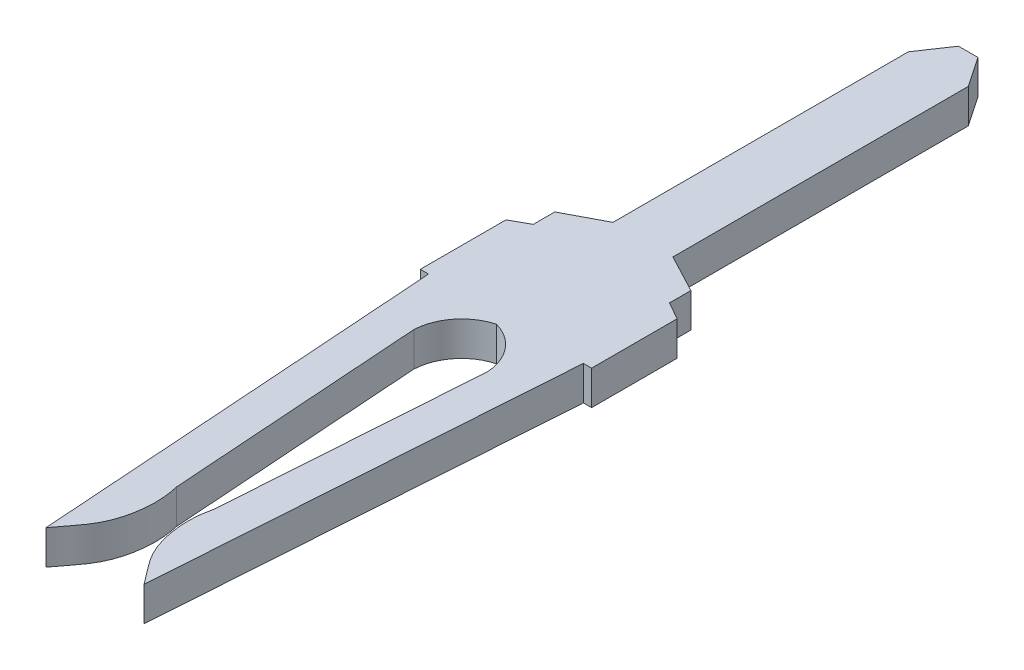
ISO-10303-21;
HEADER;
FILE_DESCRIPTION(('STEP AP214'),'2;1');
FILE_NAME('part.step','',(''),(''),'','','');
FILE_SCHEMA(('AUTOMOTIVE_DESIGN { 1 0 10303 214 1 1 1 1 }'));
ENDSEC;
DATA;
#1=APPLICATION_CONTEXT('core data for automotive mechanical design processes');
#2=APPLICATION_PROTOCOL_DEFINITION('international standard','automotive_design',2000,#1);
#3=PRODUCT_CONTEXT('',#1,'mechanical');
#4=PRODUCT('Part','Part','',(#3));
#5=PRODUCT_RELATED_PRODUCT_CATEGORY('part','',(#4));
#6=PRODUCT_DEFINITION_FORMATION('','',#4);
#7=PRODUCT_DEFINITION_CONTEXT('part definition',#1,'design');
#8=PRODUCT_DEFINITION('design','',#6,#7);
#9=PRODUCT_DEFINITION_SHAPE('','',#8);
#10=(LENGTH_UNIT() NAMED_UNIT(*) SI_UNIT(.MILLI.,.METRE.));
#11=(NAMED_UNIT(*) PLANE_ANGLE_UNIT() SI_UNIT($,.RADIAN.));
#12=(NAMED_UNIT(*) SI_UNIT($,.STERADIAN.) SOLID_ANGLE_UNIT());
#13=UNCERTAINTY_MEASURE_WITH_UNIT(LENGTH_MEASURE(1.E-05),#10,'distance_accuracy_value','');
#14=(GEOMETRIC_REPRESENTATION_CONTEXT(3) GLOBAL_UNCERTAINTY_ASSIGNED_CONTEXT((#13)) GLOBAL_UNIT_ASSIGNED_CONTEXT((#10,
#11,#12)) REPRESENTATION_CONTEXT('',''));
#15=CARTESIAN_POINT('',(0.,0.,0.));
#16=DIRECTION('',(0.,0.,1.));
#17=DIRECTION('',(1.,0.,0.));
#18=AXIS2_PLACEMENT_3D('',#15,#16,#17);
#19=CARTESIAN_POINT('',(-0.246151696229,0.,5.652903953342));
#20=DIRECTION('',(0.,1.,0.));
#21=DIRECTION('',(0.,0.,1.));
#22=AXIS2_PLACEMENT_3D('',#19,#20,#21);
#23=PLANE('',#22);
#24=DIRECTION('',(1.,0.,0.));
#25=VECTOR('',#24,1.);
#26=CARTESIAN_POINT('',(-0.246151696229,0.,-4.02319745895));
#27=LINE('',#26,#25);
#28=CARTESIAN_POINT('',(0.113873753397,0.,-4.02319745895));
#29=VERTEX_POINT('',#28);
#30=CARTESIAN_POINT('',(-0.113873753397,0.,-4.02319745895));
#31=VERTEX_POINT('',#30);
#32=EDGE_CURVE('E280',#29,#31,#27,.F.);
#33=ORIENTED_EDGE('',*,*,#32,.F.);
#34=DIRECTION('',(-0.55927147254417,0.,-0.828984571628613));
#35=VECTOR('',#34,1.);
#36=CARTESIAN_POINT('',(0.35,0.,-3.67319745895));
#37=LINE('',#36,#35);
#38=CARTESIAN_POINT('',(0.35,0.,-3.67319745895));
#39=VERTEX_POINT('',#38);
#40=EDGE_CURVE('E329',#39,#29,#37,.T.);
#41=ORIENTED_EDGE('',*,*,#40,.F.);
#42=DIRECTION('',(0.,0.,1.));
#43=VECTOR('',#42,1.);
#44=CARTESIAN_POINT('',(0.35,0.,-0.22319745895));
#45=LINE('',#44,#43);
#46=CARTESIAN_POINT('',(0.350000000000108,0.,-0.223197458950205));
#47=VERTEX_POINT('',#46);
#48=EDGE_CURVE('E339',#39,#47,#45,.T.);
#49=ORIENTED_EDGE('',*,*,#48,.T.);
#50=DIRECTION('',(0.884537528884218,0.,0.466469034337115));
#51=VECTOR('',#50,1.);
#52=CARTESIAN_POINT('',(0.795049227589,0.,0.01150336113542));
#53=LINE('',#52,#51);
#54=CARTESIAN_POINT('',(0.795049227589,0.,0.0115033611354195));
#55=VERTEX_POINT('',#54);
#56=EDGE_CURVE('E403',#47,#55,#53,.T.);
#57=ORIENTED_EDGE('',*,*,#56,.T.);
#58=DIRECTION('',(0.,0.,1.));
#59=VECTOR('',#58,1.);
#60=CARTESIAN_POINT('',(0.795049227589,0.,0.262440024241));
#61=LINE('',#60,#59);
#62=CARTESIAN_POINT('',(0.795049227588895,0.,0.262440024241189));
#63=VERTEX_POINT('',#62);
#64=EDGE_CURVE('E408',#55,#63,#61,.T.);
#65=ORIENTED_EDGE('',*,*,#64,.T.);
#66=DIRECTION('',(0.873249577630097,0.,0.487273203828054));
#67=VECTOR('',#66,1.);
#68=CARTESIAN_POINT('',(1.,0.,0.37680254105));
#69=LINE('',#68,#67);
#70=CARTESIAN_POINT('',(1.,0.,0.37680254105));
#71=VERTEX_POINT('',#70);
#72=EDGE_CURVE('E413',#63,#71,#69,.T.);
#73=ORIENTED_EDGE('',*,*,#72,.T.);
#74=DIRECTION('',(0.,0.,1.));
#75=VECTOR('',#74,1.);
#76=CARTESIAN_POINT('',(1.,0.,1.37680254105));
#77=LINE('',#76,#75);
#78=CARTESIAN_POINT('',(1.,0.,1.37680254105));
#79=VERTEX_POINT('',#78);
#80=EDGE_CURVE('E418',#71,#79,#77,.T.);
#81=ORIENTED_EDGE('',*,*,#80,.T.);
#82=DIRECTION('',(-1.,0.,0.));
#83=VECTOR('',#82,1.);
#84=CARTESIAN_POINT('',(0.90406091182,0.,1.37680254105));
#85=LINE('',#84,#83);
#86=CARTESIAN_POINT('',(0.904060911820046,0.,1.37680254105));
#87=VERTEX_POINT('',#86);
#88=EDGE_CURVE('E290',#79,#87,#85,.T.);
#89=ORIENTED_EDGE('',*,*,#88,.T.);
#90=DIRECTION('',(-0.0688630511178736,0.,0.997626122448053));
#91=VECTOR('',#90,1.);
#92=CARTESIAN_POINT('',(0.572731731551,0.,6.17680254105));
#93=LINE('',#92,#91);
#94=CARTESIAN_POINT('',(0.572731731551,0.,6.17680254105));
#95=VERTEX_POINT('',#94);
#96=EDGE_CURVE('E283',#87,#95,#93,.T.);
#97=ORIENTED_EDGE('',*,*,#96,.T.);
#98=CARTESIAN_POINT('',(0.222849497996,0.,5.000667554773));
#99=CARTESIAN_POINT('',(0.187985398045,0.,5.161915521912));
#100=CARTESIAN_POINT('',(0.181441154277,0.,5.437578205445));
#101=CARTESIAN_POINT('',(0.271539644198,0.,5.819941023181));
#102=CARTESIAN_POINT('',(0.496322858964,0.,6.066977657199));
#103=CARTESIAN_POINT('',(0.572731731551,0.,6.17680254105));
#104=(BOUNDED_CURVE() B_SPLINE_CURVE(3,(#98,#99,#100,#101,#102,#103),.UNSPECIFIED.,.F.,
.F.) B_SPLINE_CURVE_WITH_KNOTS((4,1,1,4),(0.,0.233999874933,0.693587506264,1.),
.UNSPECIFIED.) CURVE() GEOMETRIC_REPRESENTATION_ITEM() RATIONAL_B_SPLINE_CURVE((1.,1.,1.,1.,1.,1.)) REPRESENTATION_ITEM(''));
#105=CARTESIAN_POINT('',(0.222849497996347,0.,5.00066755477302));
#106=VERTEX_POINT('',#105);
#107=EDGE_CURVE('E368',#95,#106,#104,.F.);
#108=ORIENTED_EDGE('',*,*,#107,.T.);
#109=DIRECTION('',(0.0688630511178736,0.,-0.997626122448053));
#110=VECTOR('',#109,1.);
#111=CARTESIAN_POINT('',(0.428204233383,0.,2.02567232781));
#112=LINE('',#111,#110);
#113=CARTESIAN_POINT('',(0.428204233382957,0.,2.02567232781062));
#114=VERTEX_POINT('',#113);
#115=EDGE_CURVE('E296',#106,#114,#112,.T.);
#116=ORIENTED_EDGE('',*,*,#115,.T.);
#117=CARTESIAN_POINT('',(-0.155934817315,0.,2.05123249917));
#118=DIRECTION('',(0.,1.,0.));
#119=DIRECTION('',(0.,0.,1.));
#120=AXIS2_PLACEMENT_3D('',#117,#118,#119);
#121=CIRCLE('',#120,0.584698001459);
#122=CARTESIAN_POINT('',(0.,0.,1.48771134991376));
#123=VERTEX_POINT('',#122);
#124=EDGE_CURVE('E376',#114,#123,#121,.T.);
#125=ORIENTED_EDGE('',*,*,#124,.T.);
#126=CARTESIAN_POINT('',(0.155934817315,0.,2.05123249917));
#127=DIRECTION('',(0.,1.,0.));
#128=DIRECTION('',(0.,0.,1.));
#129=AXIS2_PLACEMENT_3D('',#126,#127,#128);
#130=CIRCLE('',#129,0.584698001459);
#131=CARTESIAN_POINT('',(-0.428204233382751,0.,2.02567232780754));
#132=VERTEX_POINT('',#131);
#133=EDGE_CURVE('E382',#123,#132,#130,.T.);
#134=ORIENTED_EDGE('',*,*,#133,.T.);
#135=DIRECTION('',(0.0688630511178736,0.,0.997626122448053));
#136=VECTOR('',#135,1.);
#137=CARTESIAN_POINT('',(-0.222849497996,0.,5.000667554773));
#138=LINE('',#137,#136);
#139=CARTESIAN_POINT('',(-0.222849497996,0.,5.000667554773));
#140=VERTEX_POINT('',#139);
#141=EDGE_CURVE('E187',#132,#140,#138,.T.);
#142=ORIENTED_EDGE('',*,*,#141,.T.);
#143=CARTESIAN_POINT('',(-0.572731731551,0.,6.17680254105));
#144=CARTESIAN_POINT('',(-0.496322858964,0.,6.066977657199));
#145=CARTESIAN_POINT('',(-0.271539644198,0.,5.819941023181));
#146=CARTESIAN_POINT('',(-0.181441154277,0.,5.437578205445));
#147=CARTESIAN_POINT('',(-0.187985398045,0.,5.161915521912));
#148=CARTESIAN_POINT('',(-0.222849497996,0.,5.000667554773));
#149=(BOUNDED_CURVE() B_SPLINE_CURVE(3,(#143,#144,#145,#146,#147,#148),.UNSPECIFIED.,.F.,
.F.) B_SPLINE_CURVE_WITH_KNOTS((4,1,1,4),(0.,0.306412493736,0.766000125067,1.),
.UNSPECIFIED.) CURVE() GEOMETRIC_REPRESENTATION_ITEM() RATIONAL_B_SPLINE_CURVE((1.,1.,1.,1.,1.,1.)) REPRESENTATION_ITEM(''));
#150=CARTESIAN_POINT('',(-0.572731731550931,0.,6.17680254105));
#151=VERTEX_POINT('',#150);
#152=EDGE_CURVE('E20',#140,#151,#149,.F.);
#153=ORIENTED_EDGE('',*,*,#152,.T.);
#154=DIRECTION('',(-0.0688630511178736,0.,-0.997626122448053));
#155=VECTOR('',#154,1.);
#156=CARTESIAN_POINT('',(-0.90406091182,0.,1.37680254105));
#157=LINE('',#156,#155);
#158=CARTESIAN_POINT('',(-0.90406091182,0.,1.37680254105));
#159=VERTEX_POINT('',#158);
#160=EDGE_CURVE('E176',#151,#159,#157,.T.);
#161=ORIENTED_EDGE('',*,*,#160,.T.);
#162=DIRECTION('',(-1.,0.,0.));
#163=VECTOR('',#162,1.);
#164=CARTESIAN_POINT('',(-1.,0.,1.37680254105));
#165=LINE('',#164,#163);
#166=CARTESIAN_POINT('',(-1.,0.,1.37680254105));
#167=VERTEX_POINT('',#166);
#168=EDGE_CURVE('E202',#159,#167,#165,.T.);
#169=ORIENTED_EDGE('',*,*,#168,.T.);
#170=DIRECTION('',(0.,0.,-1.));
#171=VECTOR('',#170,1.);
#172=CARTESIAN_POINT('',(-1.,0.,0.37680254105));
#173=LINE('',#172,#171);
#174=CARTESIAN_POINT('',(-1.00000000000007,0.,0.376802541049874));
#175=VERTEX_POINT('',#174);
#176=EDGE_CURVE('E214',#167,#175,#173,.T.);
#177=ORIENTED_EDGE('',*,*,#176,.T.);
#178=DIRECTION('',(0.873249577630097,0.,-0.487273203828054));
#179=VECTOR('',#178,1.);
#180=CARTESIAN_POINT('',(-0.795049227589,0.,0.262440024241));
#181=LINE('',#180,#179);
#182=CARTESIAN_POINT('',(-0.795049227589,0.,0.262440024241));
#183=VERTEX_POINT('',#182);
#184=EDGE_CURVE('E224',#175,#183,#181,.T.);
#185=ORIENTED_EDGE('',*,*,#184,.T.);
#186=DIRECTION('',(0.,0.,-1.));
#187=VECTOR('',#186,1.);
#188=CARTESIAN_POINT('',(-0.795049227589,0.,0.01150336113542));
#189=LINE('',#188,#187);
#190=CARTESIAN_POINT('',(-0.795049227588928,0.,0.0115033611355565));
#191=VERTEX_POINT('',#190);
#192=EDGE_CURVE('E234',#183,#191,#189,.T.);
#193=ORIENTED_EDGE('',*,*,#192,.T.);
#194=DIRECTION('',(0.884537528884218,0.,-0.466469034337115));
#195=VECTOR('',#194,1.);
#196=CARTESIAN_POINT('',(-0.35,0.,-0.22319745895));
#197=LINE('',#196,#195);
#198=CARTESIAN_POINT('',(-0.35,0.,-0.22319745895));
#199=VERTEX_POINT('',#198);
#200=EDGE_CURVE('E244',#191,#199,#197,.T.);
#201=ORIENTED_EDGE('',*,*,#200,.T.);
#202=DIRECTION('',(0.,0.,-1.));
#203=VECTOR('',#202,1.);
#204=CARTESIAN_POINT('',(-0.35,0.,-3.67319745895));
#205=LINE('',#204,#203);
#206=CARTESIAN_POINT('',(-0.35000000000012,0.,-3.67319745895008));
#207=VERTEX_POINT('',#206);
#208=EDGE_CURVE('E254',#199,#207,#205,.T.);
#209=ORIENTED_EDGE('',*,*,#208,.T.);
#210=DIRECTION('',(0.559271472545025,0.,-0.828984571628037));
#211=VECTOR('',#210,1.);
#212=CARTESIAN_POINT('',(-0.113873753397,0.,-4.02319745895));
#213=LINE('',#212,#211);
#214=EDGE_CURVE('E264',#207,#31,#213,.T.);
#215=ORIENTED_EDGE('',*,*,#214,.T.);
#216=EDGE_LOOP('',(#33,#41,#49,#57,#65,#73,#81,#89,#97,#108,#116,#125,#134,#142,#153,#161,#169,
#177,#185,#193,#201,#209,#215));
#217=FACE_BOUND('',#216,.T.);
#218=ADVANCED_FACE('F17',(#217),#23,.F.);
#219=CARTESIAN_POINT('',(-0.113873753397,0.4,-4.02319745895));
#220=DIRECTION('',(0.828984571628037,0.,0.559271472545025));
#221=DIRECTION('',(0.559271472545025,0.,-0.828984571628037));
#222=AXIS2_PLACEMENT_3D('',#219,#220,#221);
#223=PLANE('',#222);
#224=DIRECTION('',(0.,1.,0.));
#225=VECTOR('',#224,1.);
#226=CARTESIAN_POINT('',(-0.35,0.4,-3.67319745895));
#227=LINE('',#226,#225);
#228=CARTESIAN_POINT('',(-0.35,0.4,-3.67319745895));
#229=VERTEX_POINT('',#228);
#230=EDGE_CURVE('E262',#207,#229,#227,.T.);
#231=ORIENTED_EDGE('',*,*,#230,.T.);
#232=DIRECTION('',(-0.55927147254417,0.,0.828984571628613));
#233=VECTOR('',#232,1.);
#234=CARTESIAN_POINT('',(-0.113873753397,0.4,-4.02319745895));
#235=LINE('',#234,#233);
#236=CARTESIAN_POINT('',(-0.113873753397,0.4,-4.02319745895));
#237=VERTEX_POINT('',#236);
#238=EDGE_CURVE('E259',#237,#229,#235,.T.);
#239=ORIENTED_EDGE('',*,*,#238,.F.);
#240=DIRECTION('',(0.,1.,0.));
#241=VECTOR('',#240,1.);
#242=CARTESIAN_POINT('',(-0.113873753397,0.4,-4.02319745895));
#243=LINE('',#242,#241);
#244=EDGE_CURVE('E269',#237,#31,#243,.F.);
#245=ORIENTED_EDGE('',*,*,#244,.T.);
#246=ORIENTED_EDGE('',*,*,#214,.F.);
#247=EDGE_LOOP('',(#231,#239,#245,#246));
#248=FACE_BOUND('',#247,.T.);
#249=ADVANCED_FACE('F487',(#248),#223,.F.);
#250=CARTESIAN_POINT('',(-0.35,0.4,-3.67319745895));
#251=DIRECTION('',(1.,0.,0.));
#252=DIRECTION('',(0.,0.,-1.));
#253=AXIS2_PLACEMENT_3D('',#250,#251,#252);
#254=PLANE('',#253);
#255=DIRECTION('',(0.,1.,0.));
#256=VECTOR('',#255,1.);
#257=CARTESIAN_POINT('',(-0.35,0.4,-0.22319745895));
#258=LINE('',#257,#256);
#259=CARTESIAN_POINT('',(-0.35,0.4,-0.22319745895));
#260=VERTEX_POINT('',#259);
#261=EDGE_CURVE('E252',#199,#260,#258,.T.);
#262=ORIENTED_EDGE('',*,*,#261,.T.);
#263=DIRECTION('',(0.,0.,1.));
#264=VECTOR('',#263,1.);
#265=CARTESIAN_POINT('',(-0.35,0.4,5.652903953342));
#266=LINE('',#265,#264);
#267=EDGE_CURVE('E249',#229,#260,#266,.T.);
#268=ORIENTED_EDGE('',*,*,#267,.F.);
#269=ORIENTED_EDGE('',*,*,#230,.F.);
#270=ORIENTED_EDGE('',*,*,#208,.F.);
#271=EDGE_LOOP('',(#262,#268,#269,#270));
#272=FACE_BOUND('',#271,.T.);
#273=ADVANCED_FACE('F484',(#272),#254,.F.);
#274=CARTESIAN_POINT('',(-0.35,0.4,-0.22319745895));
#275=DIRECTION('',(0.466469034337115,0.,0.884537528884218));
#276=DIRECTION('',(0.884537528884218,0.,-0.466469034337115));
#277=AXIS2_PLACEMENT_3D('',#274,#275,#276);
#278=PLANE('',#277);
#279=DIRECTION('',(0.,1.,0.));
#280=VECTOR('',#279,1.);
#281=CARTESIAN_POINT('',(-0.795049227589,0.4,0.01150336113542));
#282=LINE('',#281,#280);
#283=CARTESIAN_POINT('',(-0.795049227589,0.4,0.0115033611354198));
#284=VERTEX_POINT('',#283);
#285=EDGE_CURVE('E242',#191,#284,#282,.T.);
#286=ORIENTED_EDGE('',*,*,#285,.T.);
#287=DIRECTION('',(-0.884537528884648,0.,0.466469034336301));
#288=VECTOR('',#287,1.);
#289=CARTESIAN_POINT('',(-0.35,0.4,-0.22319745895));
#290=LINE('',#289,#288);
#291=EDGE_CURVE('E239',#260,#284,#290,.T.);
#292=ORIENTED_EDGE('',*,*,#291,.F.);
#293=ORIENTED_EDGE('',*,*,#261,.F.);
#294=ORIENTED_EDGE('',*,*,#200,.F.);
#295=EDGE_LOOP('',(#286,#292,#293,#294));
#296=FACE_BOUND('',#295,.T.);
#297=ADVANCED_FACE('F480',(#296),#278,.F.);
#298=CARTESIAN_POINT('',(-0.795049227589,0.4,0.01150336113542));
#299=DIRECTION('',(1.,0.,0.));
#300=DIRECTION('',(0.,0.,-1.));
#301=AXIS2_PLACEMENT_3D('',#298,#299,#300);
#302=PLANE('',#301);
#303=DIRECTION('',(0.,1.,0.));
#304=VECTOR('',#303,1.);
#305=CARTESIAN_POINT('',(-0.795049227589,0.4,0.262440024241));
#306=LINE('',#305,#304);
#307=CARTESIAN_POINT('',(-0.795049227589,0.4,0.262440024241));
#308=VERTEX_POINT('',#307);
#309=EDGE_CURVE('E232',#183,#308,#306,.T.);
#310=ORIENTED_EDGE('',*,*,#309,.T.);
#311=DIRECTION('',(0.,0.,1.));
#312=VECTOR('',#311,1.);
#313=CARTESIAN_POINT('',(-0.795049227589,0.4,5.652903953342));
#314=LINE('',#313,#312);
#315=EDGE_CURVE('E229',#284,#308,#314,.T.);
#316=ORIENTED_EDGE('',*,*,#315,.F.);
#317=ORIENTED_EDGE('',*,*,#285,.F.);
#318=ORIENTED_EDGE('',*,*,#192,.F.);
#319=EDGE_LOOP('',(#310,#316,#317,#318));
#320=FACE_BOUND('',#319,.T.);
#321=ADVANCED_FACE('F476',(#320),#302,.F.);
#322=CARTESIAN_POINT('',(-0.795049227589,0.4,0.262440024241));
#323=DIRECTION('',(0.487273203828054,0.,0.873249577630097));
#324=DIRECTION('',(0.873249577630097,0.,-0.487273203828054));
#325=AXIS2_PLACEMENT_3D('',#322,#323,#324);
#326=PLANE('',#325);
#327=DIRECTION('',(0.,1.,0.));
#328=VECTOR('',#327,1.);
#329=CARTESIAN_POINT('',(-1.,0.4,0.37680254105));
#330=LINE('',#329,#328);
#331=CARTESIAN_POINT('',(-1.,0.4,0.37680254105));
#332=VERTEX_POINT('',#331);
#333=EDGE_CURVE('E222',#175,#332,#330,.T.);
#334=ORIENTED_EDGE('',*,*,#333,.T.);
#335=DIRECTION('',(-0.873249577629201,0.,0.487273203829661));
#336=VECTOR('',#335,1.);
#337=CARTESIAN_POINT('',(-0.795049227589,0.4,0.262440024241));
#338=LINE('',#337,#336);
#339=EDGE_CURVE('E219',#308,#332,#338,.T.);
#340=ORIENTED_EDGE('',*,*,#339,.F.);
#341=ORIENTED_EDGE('',*,*,#309,.F.);
#342=ORIENTED_EDGE('',*,*,#184,.F.);
#343=EDGE_LOOP('',(#334,#340,#341,#342));
#344=FACE_BOUND('',#343,.T.);
#345=ADVANCED_FACE('F472',(#344),#326,.F.);
#346=CARTESIAN_POINT('',(-1.,0.4,0.37680254105));
#347=DIRECTION('',(1.,0.,0.));
#348=DIRECTION('',(0.,0.,-1.));
#349=AXIS2_PLACEMENT_3D('',#346,#347,#348);
#350=PLANE('',#349);
#351=DIRECTION('',(0.,1.,0.));
#352=VECTOR('',#351,1.);
#353=CARTESIAN_POINT('',(-1.,0.4,1.37680254105));
#354=LINE('',#353,#352);
#355=CARTESIAN_POINT('',(-1.,0.4,1.37680254105));
#356=VERTEX_POINT('',#355);
#357=EDGE_CURVE('E212',#167,#356,#354,.T.);
#358=ORIENTED_EDGE('',*,*,#357,.T.);
#359=DIRECTION('',(0.,0.,1.));
#360=VECTOR('',#359,1.);
#361=CARTESIAN_POINT('',(-1.,0.4,5.652903953342));
#362=LINE('',#361,#360);
#363=EDGE_CURVE('E209',#332,#356,#362,.T.);
#364=ORIENTED_EDGE('',*,*,#363,.F.);
#365=ORIENTED_EDGE('',*,*,#333,.F.);
#366=ORIENTED_EDGE('',*,*,#176,.F.);
#367=EDGE_LOOP('',(#358,#364,#365,#366));
#368=FACE_BOUND('',#367,.T.);
#369=ADVANCED_FACE('F468',(#368),#350,.F.);
#370=CARTESIAN_POINT('',(-1.,0.4,1.37680254105));
#371=DIRECTION('',(0.,0.,-1.));
#372=DIRECTION('',(-1.,0.,0.));
#373=AXIS2_PLACEMENT_3D('',#370,#371,#372);
#374=PLANE('',#373);
#375=DIRECTION('',(0.,1.,0.));
#376=VECTOR('',#375,1.);
#377=CARTESIAN_POINT('',(-0.90406091182,0.4,1.37680254105));
#378=LINE('',#377,#376);
#379=CARTESIAN_POINT('',(-0.90406091182,0.4,1.37680254105));
#380=VERTEX_POINT('',#379);
#381=EDGE_CURVE('E181',#159,#380,#378,.T.);
#382=ORIENTED_EDGE('',*,*,#381,.T.);
#383=DIRECTION('',(1.,0.,0.));
#384=VECTOR('',#383,1.);
#385=CARTESIAN_POINT('',(-0.246151696229,0.4,1.37680254105));
#386=LINE('',#385,#384);
#387=EDGE_CURVE('E205',#356,#380,#386,.T.);
#388=ORIENTED_EDGE('',*,*,#387,.F.);
#389=ORIENTED_EDGE('',*,*,#357,.F.);
#390=ORIENTED_EDGE('',*,*,#168,.F.);
#391=EDGE_LOOP('',(#382,#388,#389,#390));
#392=FACE_BOUND('',#391,.T.);
#393=ADVANCED_FACE('F465',(#392),#374,.F.);
#394=CARTESIAN_POINT('',(-0.90406091182,0.4,1.37680254105));
#395=DIRECTION('',(0.997626122448053,0.,-0.0688630511178736));
#396=DIRECTION('',(-0.0688630511178736,0.,-0.997626122448053));
#397=AXIS2_PLACEMENT_3D('',#394,#395,#396);
#398=PLANE('',#397);
#399=DIRECTION('',(0.,-1.,0.));
#400=VECTOR('',#399,1.);
#401=CARTESIAN_POINT('',(-0.572731731551,0.4,6.17680254105));
#402=LINE('',#401,#400);
#403=CARTESIAN_POINT('',(-0.572731731551,0.4,6.17680254105));
#404=VERTEX_POINT('',#403);
#405=EDGE_CURVE('E179',#151,#404,#402,.F.);
#406=ORIENTED_EDGE('',*,*,#405,.T.);
#407=DIRECTION('',(0.0688630511178448,0.,0.997626122448055));
#408=VECTOR('',#407,1.);
#409=CARTESIAN_POINT('',(-0.90406091182,0.4,1.37680254105));
#410=LINE('',#409,#408);
#411=EDGE_CURVE('E208',#380,#404,#410,.T.);
#412=ORIENTED_EDGE('',*,*,#411,.F.);
#413=ORIENTED_EDGE('',*,*,#381,.F.);
#414=ORIENTED_EDGE('',*,*,#160,.F.);
#415=EDGE_LOOP('',(#406,#412,#413,#414));
#416=FACE_BOUND('',#415,.T.);
#417=ADVANCED_FACE('F177',(#416),#398,.F.);
#418=CARTESIAN_POINT('',(-0.572731731551,0.4,6.17680254105));
#419=CARTESIAN_POINT('',(-0.496322858964,0.4,6.066977657199));
#420=CARTESIAN_POINT('',(-0.271539644198,0.4,5.819941023181));
#421=CARTESIAN_POINT('',(-0.181441154277,0.4,5.437578205445));
#422=CARTESIAN_POINT('',(-0.187985398045,0.4,5.161915521912));
#423=CARTESIAN_POINT('',(-0.222849497996,0.4,5.000667554773));
#424=(BOUNDED_CURVE() B_SPLINE_CURVE(3,(#418,#419,#420,#421,#422,#423),.UNSPECIFIED.,.F.,
.F.) B_SPLINE_CURVE_WITH_KNOTS((4,1,1,4),(0.,0.306412493736,0.766000125067,1.),
.UNSPECIFIED.) CURVE() GEOMETRIC_REPRESENTATION_ITEM() RATIONAL_B_SPLINE_CURVE((1.,1.,1.,1.,1.,1.)) REPRESENTATION_ITEM(''));
#425=DIRECTION('',(0.,-1.,0.));
#426=VECTOR('',#425,1.);
#427=SURFACE_OF_LINEAR_EXTRUSION('',#424,#426);
#428=DIRECTION('',(0.,1.,0.));
#429=VECTOR('',#428,1.);
#430=CARTESIAN_POINT('',(-0.222849497996,0.4,5.000667554773));
#431=LINE('',#430,#429);
#432=CARTESIAN_POINT('',(-0.222849497996,0.4,5.000667554773));
#433=VERTEX_POINT('',#432);
#434=EDGE_CURVE('E189',#140,#433,#431,.T.);
#435=ORIENTED_EDGE('',*,*,#434,.T.);
#436=CARTESIAN_POINT('',(-0.572731731551,0.4,6.17680254105));
#437=CARTESIAN_POINT('',(-0.496322858964,0.4,6.066977657199));
#438=CARTESIAN_POINT('',(-0.271539644198,0.4,5.819941023181));
#439=CARTESIAN_POINT('',(-0.181441154277,0.4,5.437578205445));
#440=CARTESIAN_POINT('',(-0.187985398045,0.4,5.161915521912));
#441=CARTESIAN_POINT('',(-0.222849497996,0.4,5.000667554773));
#442=(BOUNDED_CURVE() B_SPLINE_CURVE(3,(#436,#437,#438,#439,#440,#441),.UNSPECIFIED.,.F.,
.F.) B_SPLINE_CURVE_WITH_KNOTS((4,1,1,4),(0.,0.306412493736,0.766000125067,1.),
.UNSPECIFIED.) CURVE() GEOMETRIC_REPRESENTATION_ITEM() RATIONAL_B_SPLINE_CURVE((1.,1.,1.,1.,1.,1.)) REPRESENTATION_ITEM(''));
#443=EDGE_CURVE('E192',#404,#433,#442,.T.);
#444=ORIENTED_EDGE('',*,*,#443,.F.);
#445=ORIENTED_EDGE('',*,*,#405,.F.);
#446=ORIENTED_EDGE('',*,*,#152,.F.);
#447=EDGE_LOOP('',(#435,#444,#445,#446));
#448=FACE_BOUND('',#447,.T.);
#449=ADVANCED_FACE('F190',(#448),#427,.F.);
#450=CARTESIAN_POINT('',(-0.222849497996,0.4,5.000667554773));
#451=DIRECTION('',(-0.997626122448053,0.,0.0688630511178736));
#452=DIRECTION('',(0.0688630511178736,0.,0.997626122448053));
#453=AXIS2_PLACEMENT_3D('',#450,#451,#452);
#454=PLANE('',#453);
#455=DIRECTION('',(0.,1.,0.));
#456=VECTOR('',#455,1.);
#457=CARTESIAN_POINT('',(-0.42820423338286,0.4,2.02567232781001));
#458=LINE('',#457,#456);
#459=CARTESIAN_POINT('',(-0.428204233382887,0.4,2.02567232781063));
#460=VERTEX_POINT('',#459);
#461=EDGE_CURVE('E301',#132,#460,#458,.T.);
#462=ORIENTED_EDGE('',*,*,#461,.T.);
#463=DIRECTION('',(-0.0688630511181063,0.,-0.997626122448037));
#464=VECTOR('',#463,1.);
#465=CARTESIAN_POINT('',(-0.222849497996,0.4,5.000667554773));
#466=LINE('',#465,#464);
#467=EDGE_CURVE('E364',#433,#460,#466,.T.);
#468=ORIENTED_EDGE('',*,*,#467,.F.);
#469=ORIENTED_EDGE('',*,*,#434,.F.);
#470=ORIENTED_EDGE('',*,*,#141,.F.);
#471=EDGE_LOOP('',(#462,#468,#469,#470));
#472=FACE_BOUND('',#471,.T.);
#473=ADVANCED_FACE('F391',(#472),#454,.F.);
#474=CARTESIAN_POINT('',(0.155934817315,0.4,2.05123249917));
#475=DIRECTION('',(0.,1.,0.));
#476=DIRECTION('',(0.,0.,1.));
#477=AXIS2_PLACEMENT_3D('',#474,#475,#476);
#478=CYLINDRICAL_SURFACE('',#477,0.584698001459);
#479=DIRECTION('',(0.,1.,0.));
#480=VECTOR('',#479,1.);
#481=CARTESIAN_POINT('',(0.,0.4,1.48771134991377));
#482=LINE('',#481,#480);
#483=CARTESIAN_POINT('',(0.,0.4,1.48771134991376));
#484=VERTEX_POINT('',#483);
#485=EDGE_CURVE('E381',#123,#484,#482,.T.);
#486=ORIENTED_EDGE('',*,*,#485,.T.);
#487=CARTESIAN_POINT('',(0.155934817315,0.4,2.05123249917));
#488=DIRECTION('',(0.,1.,0.));
#489=DIRECTION('',(0.,0.,1.));
#490=AXIS2_PLACEMENT_3D('',#487,#488,#489);
#491=CIRCLE('',#490,0.584698001459);
#492=EDGE_CURVE('E361',#460,#484,#491,.F.);
#493=ORIENTED_EDGE('',*,*,#492,.F.);
#494=ORIENTED_EDGE('',*,*,#461,.F.);
#495=ORIENTED_EDGE('',*,*,#133,.F.);
#496=EDGE_LOOP('',(#486,#493,#494,#495));
#497=FACE_BOUND('',#496,.T.);
#498=ADVANCED_FACE('F454',(#497),#478,.F.);
#499=CARTESIAN_POINT('',(-0.155934817315,0.4,2.05123249917));
#500=DIRECTION('',(0.,1.,0.));
#501=DIRECTION('',(0.,0.,1.));
#502=AXIS2_PLACEMENT_3D('',#499,#500,#501);
#503=CYLINDRICAL_SURFACE('',#502,0.584698001459);
#504=DIRECTION('',(0.,1.,0.));
#505=VECTOR('',#504,1.);
#506=CARTESIAN_POINT('',(0.428204233383,0.4,2.02567232781));
#507=LINE('',#506,#505);
#508=CARTESIAN_POINT('',(0.428204233382957,0.4,2.02567232781062));
#509=VERTEX_POINT('',#508);
#510=EDGE_CURVE('E300',#114,#509,#507,.T.);
#511=ORIENTED_EDGE('',*,*,#510,.T.);
#512=CARTESIAN_POINT('',(-0.155934817315,0.4,2.05123249917));
#513=DIRECTION('',(0.,1.,0.));
#514=DIRECTION('',(0.,0.,1.));
#515=AXIS2_PLACEMENT_3D('',#512,#513,#514);
#516=CIRCLE('',#515,0.584698001459);
#517=EDGE_CURVE('E355',#484,#509,#516,.F.);
#518=ORIENTED_EDGE('',*,*,#517,.F.);
#519=ORIENTED_EDGE('',*,*,#485,.F.);
#520=ORIENTED_EDGE('',*,*,#124,.F.);
#521=EDGE_LOOP('',(#511,#518,#519,#520));
#522=FACE_BOUND('',#521,.T.);
#523=ADVANCED_FACE('F450',(#522),#503,.F.);
#524=CARTESIAN_POINT('',(0.428204233383,0.4,2.02567232781));
#525=DIRECTION('',(0.997626122448053,0.,0.0688630511178736));
#526=DIRECTION('',(0.0688630511178736,0.,-0.997626122448053));
#527=AXIS2_PLACEMENT_3D('',#524,#525,#526);
#528=PLANE('',#527);
#529=DIRECTION('',(0.,-1.,0.));
#530=VECTOR('',#529,1.);
#531=CARTESIAN_POINT('',(0.222849497996,0.4,5.000667554773));
#532=LINE('',#531,#530);
#533=CARTESIAN_POINT('',(0.222849497996,0.4,5.000667554773));
#534=VERTEX_POINT('',#533);
#535=EDGE_CURVE('E299',#106,#534,#532,.F.);
#536=ORIENTED_EDGE('',*,*,#535,.T.);
#537=DIRECTION('',(-0.0688630511181063,0.,0.997626122448037));
#538=VECTOR('',#537,1.);
#539=CARTESIAN_POINT('',(0.428204233383,0.4,2.02567232781));
#540=LINE('',#539,#538);
#541=EDGE_CURVE('E354',#509,#534,#540,.T.);
#542=ORIENTED_EDGE('',*,*,#541,.F.);
#543=ORIENTED_EDGE('',*,*,#510,.F.);
#544=ORIENTED_EDGE('',*,*,#115,.F.);
#545=EDGE_LOOP('',(#536,#542,#543,#544));
#546=FACE_BOUND('',#545,.T.);
#547=ADVANCED_FACE('F445',(#546),#528,.F.);
#548=CARTESIAN_POINT('',(0.222849497996,0.4,5.000667554773));
#549=CARTESIAN_POINT('',(0.187985398045,0.4,5.161915521912));
#550=CARTESIAN_POINT('',(0.181441154277,0.4,5.437578205445));
#551=CARTESIAN_POINT('',(0.271539644198,0.4,5.819941023181));
#552=CARTESIAN_POINT('',(0.496322858964,0.4,6.066977657199));
#553=CARTESIAN_POINT('',(0.572731731551,0.4,6.17680254105));
#554=(BOUNDED_CURVE() B_SPLINE_CURVE(3,(#548,#549,#550,#551,#552,#553),.UNSPECIFIED.,.F.,
.F.) B_SPLINE_CURVE_WITH_KNOTS((4,1,1,4),(0.,0.233999874933,0.693587506264,1.),
.UNSPECIFIED.) CURVE() GEOMETRIC_REPRESENTATION_ITEM() RATIONAL_B_SPLINE_CURVE((1.,1.,1.,1.,1.,1.)) REPRESENTATION_ITEM(''));
#555=DIRECTION('',(0.,-1.,0.));
#556=VECTOR('',#555,1.);
#557=SURFACE_OF_LINEAR_EXTRUSION('',#554,#556);
#558=DIRECTION('',(0.,1.,0.));
#559=VECTOR('',#558,1.);
#560=CARTESIAN_POINT('',(0.572731731551,0.4,6.17680254105));
#561=LINE('',#560,#559);
#562=CARTESIAN_POINT('',(0.572731731551,0.4,6.17680254105));
#563=VERTEX_POINT('',#562);
#564=EDGE_CURVE('E287',#95,#563,#561,.T.);
#565=ORIENTED_EDGE('',*,*,#564,.T.);
#566=CARTESIAN_POINT('',(0.222849497996,0.4,5.000667554773));
#567=CARTESIAN_POINT('',(0.187985398045,0.4,5.161915521912));
#568=CARTESIAN_POINT('',(0.181441154277,0.4,5.437578205445));
#569=CARTESIAN_POINT('',(0.271539644198,0.4,5.819941023181));
#570=CARTESIAN_POINT('',(0.496322858964,0.4,6.066977657199));
#571=CARTESIAN_POINT('',(0.572731731551,0.4,6.17680254105));
#572=(BOUNDED_CURVE() B_SPLINE_CURVE(3,(#566,#567,#568,#569,#570,#571),.UNSPECIFIED.,.F.,
.F.) B_SPLINE_CURVE_WITH_KNOTS((4,1,1,4),(0.,0.233999874933,0.693587506264,1.),
.UNSPECIFIED.) CURVE() GEOMETRIC_REPRESENTATION_ITEM() RATIONAL_B_SPLINE_CURVE((1.,1.,1.,1.,1.,1.)) REPRESENTATION_ITEM(''));
#573=EDGE_CURVE('E348',#534,#563,#572,.T.);
#574=ORIENTED_EDGE('',*,*,#573,.F.);
#575=ORIENTED_EDGE('',*,*,#535,.F.);
#576=ORIENTED_EDGE('',*,*,#107,.F.);
#577=EDGE_LOOP('',(#565,#574,#575,#576));
#578=FACE_BOUND('',#577,.T.);
#579=ADVANCED_FACE('F440',(#578),#557,.F.);
#580=CARTESIAN_POINT('',(0.572731731551,0.4,6.17680254105));
#581=DIRECTION('',(-0.997626122448053,0.,-0.0688630511178736));
#582=DIRECTION('',(-0.0688630511178736,0.,0.997626122448053));
#583=AXIS2_PLACEMENT_3D('',#580,#581,#582);
#584=PLANE('',#583);
#585=DIRECTION('',(0.,1.,0.));
#586=VECTOR('',#585,1.);
#587=CARTESIAN_POINT('',(0.90406091182,0.4,1.37680254105));
#588=LINE('',#587,#586);
#589=CARTESIAN_POINT('',(0.90406091182,0.4,1.37680254105));
#590=VERTEX_POINT('',#589);
#591=EDGE_CURVE('E286',#87,#590,#588,.T.);
#592=ORIENTED_EDGE('',*,*,#591,.T.);
#593=DIRECTION('',(0.0688630511178448,0.,-0.997626122448055));
#594=VECTOR('',#593,1.);
#595=CARTESIAN_POINT('',(0.572731731551,0.4,6.17680254105));
#596=LINE('',#595,#594);
#597=EDGE_CURVE('E353',#563,#590,#596,.T.);
#598=ORIENTED_EDGE('',*,*,#597,.F.);
#599=ORIENTED_EDGE('',*,*,#564,.F.);
#600=ORIENTED_EDGE('',*,*,#96,.F.);
#601=EDGE_LOOP('',(#592,#598,#599,#600));
#602=FACE_BOUND('',#601,.T.);
#603=ADVANCED_FACE('F444',(#602),#584,.F.);
#604=CARTESIAN_POINT('',(0.90406091182,0.4,1.37680254105));
#605=DIRECTION('',(0.,0.,-1.));
#606=DIRECTION('',(-1.,0.,0.));
#607=AXIS2_PLACEMENT_3D('',#604,#605,#606);
#608=PLANE('',#607);
#609=DIRECTION('',(0.,1.,0.));
#610=VECTOR('',#609,1.);
#611=CARTESIAN_POINT('',(1.,0.4,1.37680254105));
#612=LINE('',#611,#610);
#613=CARTESIAN_POINT('',(1.,0.4,1.37680254105));
#614=VERTEX_POINT('',#613);
#615=EDGE_CURVE('E293',#79,#614,#612,.T.);
#616=ORIENTED_EDGE('',*,*,#615,.T.);
#617=DIRECTION('',(1.,0.,0.));
#618=VECTOR('',#617,1.);
#619=CARTESIAN_POINT('',(-0.246151696229,0.4,1.37680254105));
#620=LINE('',#619,#618);
#621=EDGE_CURVE('E423',#590,#614,#620,.T.);
#622=ORIENTED_EDGE('',*,*,#621,.F.);
#623=ORIENTED_EDGE('',*,*,#591,.F.);
#624=ORIENTED_EDGE('',*,*,#88,.F.);
#625=EDGE_LOOP('',(#616,#622,#623,#624));
#626=FACE_BOUND('',#625,.T.);
#627=ADVANCED_FACE('F525',(#626),#608,.F.);
#628=CARTESIAN_POINT('',(1.,0.4,1.37680254105));
#629=DIRECTION('',(-1.,0.,0.));
#630=DIRECTION('',(0.,0.,1.));
#631=AXIS2_PLACEMENT_3D('',#628,#629,#630);
#632=PLANE('',#631);
#633=DIRECTION('',(0.,1.,0.));
#634=VECTOR('',#633,1.);
#635=CARTESIAN_POINT('',(1.,0.4,0.37680254105));
#636=LINE('',#635,#634);
#637=CARTESIAN_POINT('',(1.,0.4,0.37680254105));
#638=VERTEX_POINT('',#637);
#639=EDGE_CURVE('E416',#71,#638,#636,.T.);
#640=ORIENTED_EDGE('',*,*,#639,.T.);
#641=DIRECTION('',(0.,0.,1.));
#642=VECTOR('',#641,1.);
#643=CARTESIAN_POINT('',(1.,0.4,5.652903953342));
#644=LINE('',#643,#642);
#645=EDGE_CURVE('E426',#614,#638,#644,.F.);
#646=ORIENTED_EDGE('',*,*,#645,.F.);
#647=ORIENTED_EDGE('',*,*,#615,.F.);
#648=ORIENTED_EDGE('',*,*,#80,.F.);
#649=EDGE_LOOP('',(#640,#646,#647,#648));
#650=FACE_BOUND('',#649,.T.);
#651=ADVANCED_FACE('F522',(#650),#632,.F.);
#652=CARTESIAN_POINT('',(1.,0.4,0.37680254105));
#653=DIRECTION('',(-0.487273203828054,0.,0.873249577630097));
#654=DIRECTION('',(0.873249577630097,0.,0.487273203828054));
#655=AXIS2_PLACEMENT_3D('',#652,#653,#654);
#656=PLANE('',#655);
#657=DIRECTION('',(0.,1.,0.));
#658=VECTOR('',#657,1.);
#659=CARTESIAN_POINT('',(0.795049227589,0.4,0.262440024241));
#660=LINE('',#659,#658);
#661=CARTESIAN_POINT('',(0.795049227588895,0.4,0.262440024241189));
#662=VERTEX_POINT('',#661);
#663=EDGE_CURVE('E411',#63,#662,#660,.T.);
#664=ORIENTED_EDGE('',*,*,#663,.T.);
#665=DIRECTION('',(-0.873249577629201,0.,-0.48727320382966));
#666=VECTOR('',#665,1.);
#667=CARTESIAN_POINT('',(1.,0.4,0.37680254105));
#668=LINE('',#667,#666);
#669=EDGE_CURVE('E542',#638,#662,#668,.T.);
#670=ORIENTED_EDGE('',*,*,#669,.F.);
#671=ORIENTED_EDGE('',*,*,#639,.F.);
#672=ORIENTED_EDGE('',*,*,#72,.F.);
#673=EDGE_LOOP('',(#664,#670,#671,#672));
#674=FACE_BOUND('',#673,.T.);
#675=ADVANCED_FACE('F518',(#674),#656,.F.);
#676=CARTESIAN_POINT('',(0.795049227589,0.4,0.262440024241));
#677=DIRECTION('',(-1.,0.,0.));
#678=DIRECTION('',(0.,0.,1.));
#679=AXIS2_PLACEMENT_3D('',#676,#677,#678);
#680=PLANE('',#679);
#681=DIRECTION('',(0.,1.,0.));
#682=VECTOR('',#681,1.);
#683=CARTESIAN_POINT('',(0.795049227589,0.4,0.01150336113542));
#684=LINE('',#683,#682);
#685=CARTESIAN_POINT('',(0.795049227589,0.4,0.0115033611354195));
#686=VERTEX_POINT('',#685);
#687=EDGE_CURVE('E406',#55,#686,#684,.T.);
#688=ORIENTED_EDGE('',*,*,#687,.T.);
#689=DIRECTION('',(0.,0.,1.));
#690=VECTOR('',#689,1.);
#691=CARTESIAN_POINT('',(0.795049227589,0.4,5.652903953342));
#692=LINE('',#691,#690);
#693=EDGE_CURVE('E559',#662,#686,#692,.F.);
#694=ORIENTED_EDGE('',*,*,#693,.F.);
#695=ORIENTED_EDGE('',*,*,#663,.F.);
#696=ORIENTED_EDGE('',*,*,#64,.F.);
#697=EDGE_LOOP('',(#688,#694,#695,#696));
#698=FACE_BOUND('',#697,.T.);
#699=ADVANCED_FACE('F514',(#698),#680,.F.);
#700=CARTESIAN_POINT('',(0.795049227589,0.4,0.01150336113542));
#701=DIRECTION('',(-0.466469034337115,0.,0.884537528884218));
#702=DIRECTION('',(0.884537528884218,0.,0.466469034337115));
#703=AXIS2_PLACEMENT_3D('',#700,#701,#702);
#704=PLANE('',#703);
#705=DIRECTION('',(0.,1.,0.));
#706=VECTOR('',#705,1.);
#707=CARTESIAN_POINT('',(0.35,0.4,-0.22319745895));
#708=LINE('',#707,#706);
#709=CARTESIAN_POINT('',(0.350000000000108,0.4,-0.223197458950205));
#710=VERTEX_POINT('',#709);
#711=EDGE_CURVE('E342',#47,#710,#708,.T.);
#712=ORIENTED_EDGE('',*,*,#711,.T.);
#713=DIRECTION('',(-0.884537528884648,0.,-0.466469034336301));
#714=VECTOR('',#713,1.);
#715=CARTESIAN_POINT('',(0.795049227589,0.4,0.0115033611354197));
#716=LINE('',#715,#714);
#717=EDGE_CURVE('E560',#686,#710,#716,.T.);
#718=ORIENTED_EDGE('',*,*,#717,.F.);
#719=ORIENTED_EDGE('',*,*,#687,.F.);
#720=ORIENTED_EDGE('',*,*,#56,.F.);
#721=EDGE_LOOP('',(#712,#718,#719,#720));
#722=FACE_BOUND('',#721,.T.);
#723=ADVANCED_FACE('F510',(#722),#704,.F.);
#724=CARTESIAN_POINT('',(0.35,0.4,-0.22319745895));
#725=DIRECTION('',(-1.,0.,0.));
#726=DIRECTION('',(0.,0.,1.));
#727=AXIS2_PLACEMENT_3D('',#724,#725,#726);
#728=PLANE('',#727);
#729=DIRECTION('',(0.,1.,0.));
#730=VECTOR('',#729,1.);
#731=CARTESIAN_POINT('',(0.35,0.4,-3.67319745895));
#732=LINE('',#731,#730);
#733=CARTESIAN_POINT('',(0.35,0.4,-3.67319745895));
#734=VERTEX_POINT('',#733);
#735=EDGE_CURVE('E333',#39,#734,#732,.T.);
#736=ORIENTED_EDGE('',*,*,#735,.T.);
#737=DIRECTION('',(0.,0.,1.));
#738=VECTOR('',#737,1.);
#739=CARTESIAN_POINT('',(0.35,0.4,5.652903953342));
#740=LINE('',#739,#738);
#741=EDGE_CURVE('E565',#710,#734,#740,.F.);
#742=ORIENTED_EDGE('',*,*,#741,.F.);
#743=ORIENTED_EDGE('',*,*,#711,.F.);
#744=ORIENTED_EDGE('',*,*,#48,.F.);
#745=EDGE_LOOP('',(#736,#742,#743,#744));
#746=FACE_BOUND('',#745,.T.);
#747=ADVANCED_FACE('F507',(#746),#728,.F.);
#748=CARTESIAN_POINT('',(0.35,0.4,-3.67319745895));
#749=DIRECTION('',(-0.828984571628037,0.,0.559271472545025));
#750=DIRECTION('',(0.559271472545025,0.,0.828984571628037));
#751=AXIS2_PLACEMENT_3D('',#748,#749,#750);
#752=PLANE('',#751);
#753=DIRECTION('',(0.,1.,0.));
#754=VECTOR('',#753,1.);
#755=CARTESIAN_POINT('',(0.113873753397,0.4,-4.02319745895));
#756=LINE('',#755,#754);
#757=CARTESIAN_POINT('',(0.11387375339682,0.4,-4.02319745894988));
#758=VERTEX_POINT('',#757);
#759=EDGE_CURVE('E37',#29,#758,#756,.T.);
#760=ORIENTED_EDGE('',*,*,#759,.T.);
#761=DIRECTION('',(-0.55927147254417,0.,-0.828984571628613));
#762=VECTOR('',#761,1.);
#763=CARTESIAN_POINT('',(0.35,0.4,-3.67319745895));
#764=LINE('',#763,#762);
#765=EDGE_CURVE('E28',#734,#758,#764,.T.);
#766=ORIENTED_EDGE('',*,*,#765,.F.);
#767=ORIENTED_EDGE('',*,*,#735,.F.);
#768=ORIENTED_EDGE('',*,*,#40,.T.);
#769=EDGE_LOOP('',(#760,#766,#767,#768));
#770=FACE_BOUND('',#769,.T.);
#771=ADVANCED_FACE('F501',(#770),#752,.F.);
#772=CARTESIAN_POINT('',(0.,0.4,-4.02319745895));
#773=DIRECTION('',(0.,0.,1.));
#774=DIRECTION('',(1.,0.,0.));
#775=AXIS2_PLACEMENT_3D('',#772,#773,#774);
#776=PLANE('',#775);
#777=ORIENTED_EDGE('',*,*,#244,.F.);
#778=DIRECTION('',(1.,0.,0.));
#779=VECTOR('',#778,1.);
#780=CARTESIAN_POINT('',(-0.246151696229,0.4,-4.02319745895));
#781=LINE('',#780,#779);
#782=EDGE_CURVE('E11',#758,#237,#781,.F.);
#783=ORIENTED_EDGE('',*,*,#782,.F.);
#784=ORIENTED_EDGE('',*,*,#759,.F.);
#785=ORIENTED_EDGE('',*,*,#32,.T.);
#786=EDGE_LOOP('',(#777,#783,#784,#785));
#787=FACE_BOUND('',#786,.T.);
#788=ADVANCED_FACE('F496',(#787),#776,.F.);
#789=CARTESIAN_POINT('',(-0.246151696229,0.4,5.652903953342));
#790=DIRECTION('',(0.,1.,0.));
#791=DIRECTION('',(0.,0.,1.));
#792=AXIS2_PLACEMENT_3D('',#789,#790,#791);
#793=PLANE('',#792);
#794=ORIENTED_EDGE('',*,*,#765,.T.);
#795=ORIENTED_EDGE('',*,*,#782,.T.);
#796=ORIENTED_EDGE('',*,*,#238,.T.);
#797=ORIENTED_EDGE('',*,*,#267,.T.);
#798=ORIENTED_EDGE('',*,*,#291,.T.);
#799=ORIENTED_EDGE('',*,*,#315,.T.);
#800=ORIENTED_EDGE('',*,*,#339,.T.);
#801=ORIENTED_EDGE('',*,*,#363,.T.);
#802=ORIENTED_EDGE('',*,*,#387,.T.);
#803=ORIENTED_EDGE('',*,*,#411,.T.);
#804=ORIENTED_EDGE('',*,*,#443,.T.);
#805=ORIENTED_EDGE('',*,*,#467,.T.);
#806=ORIENTED_EDGE('',*,*,#492,.T.);
#807=ORIENTED_EDGE('',*,*,#517,.T.);
#808=ORIENTED_EDGE('',*,*,#541,.T.);
#809=ORIENTED_EDGE('',*,*,#573,.T.);
#810=ORIENTED_EDGE('',*,*,#597,.T.);
#811=ORIENTED_EDGE('',*,*,#621,.T.);
#812=ORIENTED_EDGE('',*,*,#645,.T.);
#813=ORIENTED_EDGE('',*,*,#669,.T.);
#814=ORIENTED_EDGE('',*,*,#693,.T.);
#815=ORIENTED_EDGE('',*,*,#717,.T.);
#816=ORIENTED_EDGE('',*,*,#741,.T.);
#817=EDGE_LOOP('',(#794,#795,#796,#797,#798,#799,#800,#801,#802,#803,#804,#805,#806,#807,#808,
#809,#810,#811,#812,#813,#814,#815,#816));
#818=FACE_BOUND('',#817,.T.);
#819=ADVANCED_FACE('F395',(#818),#793,.T.);
#820=CLOSED_SHELL('',(#218,#249,#273,#297,#321,#345,#369,#393,#417,#449,#473,#498,#523,#547,
#579,#603,#627,#651,#675,#699,#723,#747,#771,#788,#819));
#821=MANIFOLD_SOLID_BREP('B1',#820);
#822=ADVANCED_BREP_SHAPE_REPRESENTATION('',(#18,#821),#14);
#823=SHAPE_DEFINITION_REPRESENTATION(#9,#822);
ENDSEC;
END-ISO-10303-21;
